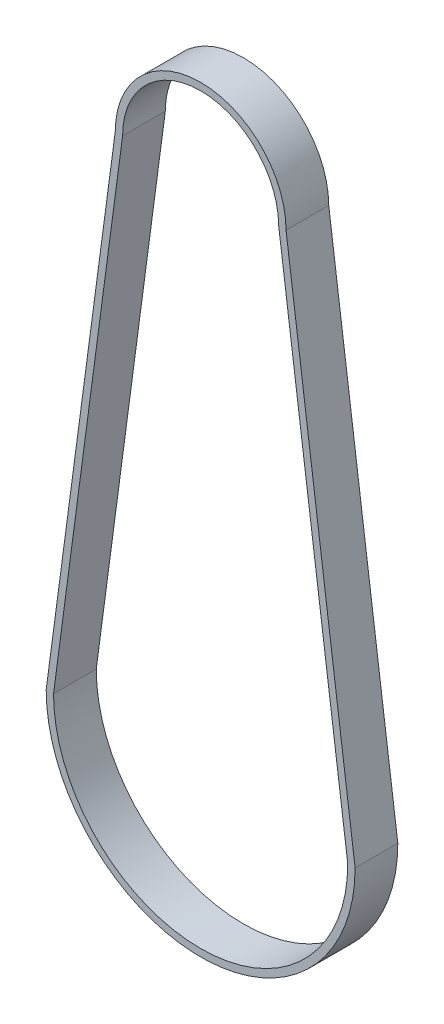
ISO-10303-21;
HEADER;
FILE_DESCRIPTION(('STEP AP214'),'2;1');
FILE_NAME('part.step','',(''),(''),'','','');
FILE_SCHEMA(('AUTOMOTIVE_DESIGN { 1 0 10303 214 1 1 1 1 }'));
ENDSEC;
DATA;
#1=APPLICATION_CONTEXT('core data for automotive mechanical design processes');
#2=APPLICATION_PROTOCOL_DEFINITION('international standard','automotive_design',2000,#1);
#3=PRODUCT_CONTEXT('',#1,'mechanical');
#4=PRODUCT('Part','Part','',(#3));
#5=PRODUCT_RELATED_PRODUCT_CATEGORY('part','',(#4));
#6=PRODUCT_DEFINITION_FORMATION('','',#4);
#7=PRODUCT_DEFINITION_CONTEXT('part definition',#1,'design');
#8=PRODUCT_DEFINITION('design','',#6,#7);
#9=PRODUCT_DEFINITION_SHAPE('','',#8);
#10=(LENGTH_UNIT() NAMED_UNIT(*) SI_UNIT(.MILLI.,.METRE.));
#11=(NAMED_UNIT(*) PLANE_ANGLE_UNIT() SI_UNIT($,.RADIAN.));
#12=(NAMED_UNIT(*) SI_UNIT($,.STERADIAN.) SOLID_ANGLE_UNIT());
#13=UNCERTAINTY_MEASURE_WITH_UNIT(LENGTH_MEASURE(1.E-05),#10,'distance_accuracy_value','');
#14=(GEOMETRIC_REPRESENTATION_CONTEXT(3) GLOBAL_UNCERTAINTY_ASSIGNED_CONTEXT((#13)) GLOBAL_UNIT_ASSIGNED_CONTEXT((#10,
#11,#12)) REPRESENTATION_CONTEXT('',''));
#15=CARTESIAN_POINT('',(0.,0.,0.));
#16=DIRECTION('',(0.,0.,1.));
#17=DIRECTION('',(1.,0.,0.));
#18=AXIS2_PLACEMENT_3D('',#15,#16,#17);
#19=CARTESIAN_POINT('',(0.,0.,-12.5));
#20=DIRECTION('',(0.,0.,1.));
#21=DIRECTION('',(1.,0.,0.));
#22=AXIS2_PLACEMENT_3D('',#19,#20,#21);
#23=CYLINDRICAL_SURFACE('',#22,49.975);
#24=DIRECTION('',(0.,0.,1.));
#25=VECTOR('',#24,1.);
#26=CARTESIAN_POINT('',(-49.975,0.,-12.5));
#27=LINE('',#26,#25);
#28=CARTESIAN_POINT('',(-49.975,0.,-12.5));
#29=VERTEX_POINT('',#28);
#30=CARTESIAN_POINT('',(-49.975,0.,12.5));
#31=VERTEX_POINT('',#30);
#32=EDGE_CURVE('E48',#29,#31,#27,.T.);
#33=ORIENTED_EDGE('',*,*,#32,.T.);
#34=CARTESIAN_POINT('',(0.,0.,12.5));
#35=DIRECTION('',(0.,0.,1.));
#36=DIRECTION('',(1.,0.,0.));
#37=AXIS2_PLACEMENT_3D('',#34,#35,#36);
#38=CIRCLE('',#37,49.975);
#39=CARTESIAN_POINT('',(49.975,0.,12.5));
#40=VERTEX_POINT('',#39);
#41=EDGE_CURVE('E140',#40,#31,#38,.T.);
#42=ORIENTED_EDGE('',*,*,#41,.F.);
#43=DIRECTION('',(0.,0.,1.));
#44=VECTOR('',#43,1.);
#45=CARTESIAN_POINT('',(49.975,0.,-12.5));
#46=LINE('',#45,#44);
#47=CARTESIAN_POINT('',(49.975,0.,-12.5));
#48=VERTEX_POINT('',#47);
#49=EDGE_CURVE('E11',#48,#40,#46,.T.);
#50=ORIENTED_EDGE('',*,*,#49,.F.);
#51=CARTESIAN_POINT('',(0.,0.,-12.5));
#52=DIRECTION('',(0.,0.,1.));
#53=DIRECTION('',(1.,0.,0.));
#54=AXIS2_PLACEMENT_3D('',#51,#52,#53);
#55=CIRCLE('',#54,49.975);
#56=EDGE_CURVE('E159',#48,#29,#55,.T.);
#57=ORIENTED_EDGE('',*,*,#56,.T.);
#58=EDGE_LOOP('',(#33,#42,#50,#57));
#59=FACE_BOUND('',#58,.T.);
#60=ADVANCED_FACE('F45',(#59),#23,.T.);
#61=CARTESIAN_POINT('',(49.975,0.,-12.5));
#62=DIRECTION('',(0.991217183417387,0.132244074718309,0.));
#63=DIRECTION('',(-0.132244074718309,0.991217183417387,0.));
#64=AXIS2_PLACEMENT_3D('',#61,#62,#63);
#65=PLANE('',#64);
#66=ORIENTED_EDGE('',*,*,#49,.T.);
#67=DIRECTION('',(-0.132244074718309,0.991217183417387,0.));
#68=VECTOR('',#67,1.);
#69=CARTESIAN_POINT('',(49.975,0.,12.5));
#70=LINE('',#69,#68);
#71=CARTESIAN_POINT('',(90.3999999999999,-303.,12.5));
#72=VERTEX_POINT('',#71);
#73=EDGE_CURVE('E149',#72,#40,#70,.T.);
#74=ORIENTED_EDGE('',*,*,#73,.F.);
#75=DIRECTION('',(0.,0.,1.));
#76=VECTOR('',#75,1.);
#77=CARTESIAN_POINT('',(90.3999999999999,-303.,-12.5));
#78=LINE('',#77,#76);
#79=CARTESIAN_POINT('',(90.3999999999999,-303.,-12.5));
#80=VERTEX_POINT('',#79);
#81=EDGE_CURVE('E53',#80,#72,#78,.T.);
#82=ORIENTED_EDGE('',*,*,#81,.F.);
#83=DIRECTION('',(-0.132244074718309,0.991217183417387,0.));
#84=VECTOR('',#83,1.);
#85=CARTESIAN_POINT('',(49.975,0.,-12.5));
#86=LINE('',#85,#84);
#87=EDGE_CURVE('E170',#80,#48,#86,.T.);
#88=ORIENTED_EDGE('',*,*,#87,.T.);
#89=EDGE_LOOP('',(#66,#74,#82,#88));
#90=FACE_BOUND('',#89,.T.);
#91=ADVANCED_FACE('F182',(#90),#65,.T.);
#92=CARTESIAN_POINT('',(0.,-303.,-12.5));
#93=DIRECTION('',(0.,0.,1.));
#94=DIRECTION('',(1.,0.,0.));
#95=AXIS2_PLACEMENT_3D('',#92,#93,#94);
#96=CYLINDRICAL_SURFACE('',#95,90.4);
#97=ORIENTED_EDGE('',*,*,#81,.T.);
#98=CARTESIAN_POINT('',(0.,-303.,12.5));
#99=DIRECTION('',(0.,0.,1.));
#100=DIRECTION('',(1.,0.,0.));
#101=AXIS2_PLACEMENT_3D('',#98,#99,#100);
#102=CIRCLE('',#101,90.4);
#103=CARTESIAN_POINT('',(-90.4000000000001,-303.,12.5));
#104=VERTEX_POINT('',#103);
#105=EDGE_CURVE('E146',#104,#72,#102,.T.);
#106=ORIENTED_EDGE('',*,*,#105,.F.);
#107=DIRECTION('',(0.,0.,1.));
#108=VECTOR('',#107,1.);
#109=CARTESIAN_POINT('',(-90.4000000000001,-303.,-12.5));
#110=LINE('',#109,#108);
#111=CARTESIAN_POINT('',(-90.4000000000001,-303.,-12.5));
#112=VERTEX_POINT('',#111);
#113=EDGE_CURVE('E173',#112,#104,#110,.T.);
#114=ORIENTED_EDGE('',*,*,#113,.F.);
#115=CARTESIAN_POINT('',(0.,-303.,-12.5));
#116=DIRECTION('',(0.,0.,1.));
#117=DIRECTION('',(1.,0.,0.));
#118=AXIS2_PLACEMENT_3D('',#115,#116,#117);
#119=CIRCLE('',#118,90.4);
#120=EDGE_CURVE('E167',#112,#80,#119,.T.);
#121=ORIENTED_EDGE('',*,*,#120,.T.);
#122=EDGE_LOOP('',(#97,#106,#114,#121));
#123=FACE_BOUND('',#122,.T.);
#124=ADVANCED_FACE('F188',(#123),#96,.T.);
#125=CARTESIAN_POINT('',(-49.975,0.,-12.5));
#126=DIRECTION('',(-0.991217183417387,0.13224407471831,0.));
#127=DIRECTION('',(-0.13224407471831,-0.991217183417387,0.));
#128=AXIS2_PLACEMENT_3D('',#125,#126,#127);
#129=PLANE('',#128);
#130=ORIENTED_EDGE('',*,*,#113,.T.);
#131=DIRECTION('',(-0.13224407471831,-0.991217183417387,0.));
#132=VECTOR('',#131,1.);
#133=CARTESIAN_POINT('',(-49.975,0.,12.5));
#134=LINE('',#133,#132);
#135=EDGE_CURVE('E143',#31,#104,#134,.T.);
#136=ORIENTED_EDGE('',*,*,#135,.F.);
#137=ORIENTED_EDGE('',*,*,#32,.F.);
#138=DIRECTION('',(-0.13224407471831,-0.991217183417387,0.));
#139=VECTOR('',#138,1.);
#140=CARTESIAN_POINT('',(-49.975,0.,-12.5));
#141=LINE('',#140,#139);
#142=EDGE_CURVE('E164',#29,#112,#141,.T.);
#143=ORIENTED_EDGE('',*,*,#142,.T.);
#144=EDGE_LOOP('',(#130,#136,#137,#143));
#145=FACE_BOUND('',#144,.T.);
#146=ADVANCED_FACE('F177',(#145),#129,.T.);
#147=CARTESIAN_POINT('',(0.,0.,-12.5));
#148=DIRECTION('',(0.,0.,1.));
#149=DIRECTION('',(1.,0.,0.));
#150=AXIS2_PLACEMENT_3D('',#147,#148,#149);
#151=PLANE('',#150);
#152=DIRECTION('',(-0.13224407471831,-0.991217183417387,0.));
#153=VECTOR('',#152,1.);
#154=CARTESIAN_POINT('',(-45.675,0.,-12.5));
#155=LINE('',#154,#153);
#156=CARTESIAN_POINT('',(-45.675,0.,-12.5));
#157=VERTEX_POINT('',#156);
#158=CARTESIAN_POINT('',(-86.1000000000001,-303.,-12.5));
#159=VERTEX_POINT('',#158);
#160=EDGE_CURVE('E122',#157,#159,#155,.T.);
#161=ORIENTED_EDGE('',*,*,#160,.T.);
#162=CARTESIAN_POINT('',(0.,-303.,-12.5));
#163=DIRECTION('',(0.,0.,1.));
#164=DIRECTION('',(1.,0.,0.));
#165=AXIS2_PLACEMENT_3D('',#162,#163,#164);
#166=CIRCLE('',#165,86.1);
#167=CARTESIAN_POINT('',(86.0999999999999,-303.,-12.5));
#168=VERTEX_POINT('',#167);
#169=EDGE_CURVE('E152',#159,#168,#166,.T.);
#170=ORIENTED_EDGE('',*,*,#169,.T.);
#171=DIRECTION('',(-0.132244074718309,0.991217183417387,0.));
#172=VECTOR('',#171,1.);
#173=CARTESIAN_POINT('',(86.0999999999999,-303.,-12.5));
#174=LINE('',#173,#172);
#175=CARTESIAN_POINT('',(45.675,0.,-12.5));
#176=VERTEX_POINT('',#175);
#177=EDGE_CURVE('E117',#168,#176,#174,.T.);
#178=ORIENTED_EDGE('',*,*,#177,.T.);
#179=CARTESIAN_POINT('',(0.,0.,-12.5));
#180=DIRECTION('',(0.,0.,1.));
#181=DIRECTION('',(1.,0.,0.));
#182=AXIS2_PLACEMENT_3D('',#179,#180,#181);
#183=CIRCLE('',#182,45.675);
#184=EDGE_CURVE('E61',#176,#157,#183,.T.);
#185=ORIENTED_EDGE('',*,*,#184,.T.);
#186=EDGE_LOOP('',(#161,#170,#178,#185));
#187=FACE_BOUND('',#186,.T.);
#188=ORIENTED_EDGE('',*,*,#56,.F.);
#189=ORIENTED_EDGE('',*,*,#87,.F.);
#190=ORIENTED_EDGE('',*,*,#120,.F.);
#191=ORIENTED_EDGE('',*,*,#142,.F.);
#192=EDGE_LOOP('',(#188,#189,#190,#191));
#193=FACE_BOUND('',#192,.T.);
#194=ADVANCED_FACE('F186',(#187,#193),#151,.F.);
#195=CARTESIAN_POINT('',(0.,-303.,-12.5));
#196=DIRECTION('',(0.,0.,1.));
#197=DIRECTION('',(1.,0.,0.));
#198=AXIS2_PLACEMENT_3D('',#195,#196,#197);
#199=CYLINDRICAL_SURFACE('',#198,86.1);
#200=DIRECTION('',(0.,0.,1.));
#201=VECTOR('',#200,1.);
#202=CARTESIAN_POINT('',(-86.1000000000001,-303.,-12.5));
#203=LINE('',#202,#201);
#204=CARTESIAN_POINT('',(-86.1000000000001,-303.,12.5));
#205=VERTEX_POINT('',#204);
#206=EDGE_CURVE('E127',#159,#205,#203,.T.);
#207=ORIENTED_EDGE('',*,*,#206,.T.);
#208=CARTESIAN_POINT('',(0.,-303.,12.5));
#209=DIRECTION('',(0.,0.,1.));
#210=DIRECTION('',(1.,0.,0.));
#211=AXIS2_PLACEMENT_3D('',#208,#209,#210);
#212=CIRCLE('',#211,86.1);
#213=CARTESIAN_POINT('',(86.0999999999999,-303.,12.5));
#214=VERTEX_POINT('',#213);
#215=EDGE_CURVE('E125',#205,#214,#212,.T.);
#216=ORIENTED_EDGE('',*,*,#215,.T.);
#217=DIRECTION('',(0.,0.,1.));
#218=VECTOR('',#217,1.);
#219=CARTESIAN_POINT('',(86.0999999999999,-303.,-12.5));
#220=LINE('',#219,#218);
#221=EDGE_CURVE('E110',#168,#214,#220,.T.);
#222=ORIENTED_EDGE('',*,*,#221,.F.);
#223=ORIENTED_EDGE('',*,*,#169,.F.);
#224=EDGE_LOOP('',(#207,#216,#222,#223));
#225=FACE_BOUND('',#224,.T.);
#226=ADVANCED_FACE('F126',(#225),#199,.F.);
#227=CARTESIAN_POINT('',(-45.675,0.,-12.5));
#228=DIRECTION('',(-0.991217183417387,0.13224407471831,0.));
#229=DIRECTION('',(-0.13224407471831,-0.991217183417387,0.));
#230=AXIS2_PLACEMENT_3D('',#227,#228,#229);
#231=PLANE('',#230);
#232=DIRECTION('',(0.,0.,1.));
#233=VECTOR('',#232,1.);
#234=CARTESIAN_POINT('',(-45.675,0.,-12.5));
#235=LINE('',#234,#233);
#236=CARTESIAN_POINT('',(-45.675,0.,12.5));
#237=VERTEX_POINT('',#236);
#238=EDGE_CURVE('E160',#157,#237,#235,.T.);
#239=ORIENTED_EDGE('',*,*,#238,.T.);
#240=DIRECTION('',(-0.13224407471831,-0.991217183417387,0.));
#241=VECTOR('',#240,1.);
#242=CARTESIAN_POINT('',(-45.675,0.,12.5));
#243=LINE('',#242,#241);
#244=EDGE_CURVE('E136',#237,#205,#243,.T.);
#245=ORIENTED_EDGE('',*,*,#244,.T.);
#246=ORIENTED_EDGE('',*,*,#206,.F.);
#247=ORIENTED_EDGE('',*,*,#160,.F.);
#248=EDGE_LOOP('',(#239,#245,#246,#247));
#249=FACE_BOUND('',#248,.T.);
#250=ADVANCED_FACE('F223',(#249),#231,.F.);
#251=CARTESIAN_POINT('',(0.,0.,-12.5));
#252=DIRECTION('',(0.,0.,1.));
#253=DIRECTION('',(1.,0.,0.));
#254=AXIS2_PLACEMENT_3D('',#251,#252,#253);
#255=CYLINDRICAL_SURFACE('',#254,45.675);
#256=DIRECTION('',(0.,0.,1.));
#257=VECTOR('',#256,1.);
#258=CARTESIAN_POINT('',(45.675,0.,-12.5));
#259=LINE('',#258,#257);
#260=CARTESIAN_POINT('',(45.675,0.,12.5));
#261=VERTEX_POINT('',#260);
#262=EDGE_CURVE('E121',#176,#261,#259,.T.);
#263=ORIENTED_EDGE('',*,*,#262,.T.);
#264=CARTESIAN_POINT('',(0.,0.,12.5));
#265=DIRECTION('',(0.,0.,1.));
#266=DIRECTION('',(1.,0.,0.));
#267=AXIS2_PLACEMENT_3D('',#264,#265,#266);
#268=CIRCLE('',#267,45.675);
#269=EDGE_CURVE('E134',#261,#237,#268,.T.);
#270=ORIENTED_EDGE('',*,*,#269,.T.);
#271=ORIENTED_EDGE('',*,*,#238,.F.);
#272=ORIENTED_EDGE('',*,*,#184,.F.);
#273=EDGE_LOOP('',(#263,#270,#271,#272));
#274=FACE_BOUND('',#273,.T.);
#275=ADVANCED_FACE('F230',(#274),#255,.F.);
#276=CARTESIAN_POINT('',(86.0999999999999,-303.,-12.5));
#277=DIRECTION('',(0.991217183417387,0.132244074718309,0.));
#278=DIRECTION('',(-0.132244074718309,0.991217183417387,0.));
#279=AXIS2_PLACEMENT_3D('',#276,#277,#278);
#280=PLANE('',#279);
#281=ORIENTED_EDGE('',*,*,#221,.T.);
#282=DIRECTION('',(-0.132244074718309,0.991217183417387,0.));
#283=VECTOR('',#282,1.);
#284=CARTESIAN_POINT('',(86.0999999999999,-303.,12.5));
#285=LINE('',#284,#283);
#286=EDGE_CURVE('E114',#214,#261,#285,.T.);
#287=ORIENTED_EDGE('',*,*,#286,.T.);
#288=ORIENTED_EDGE('',*,*,#262,.F.);
#289=ORIENTED_EDGE('',*,*,#177,.F.);
#290=EDGE_LOOP('',(#281,#287,#288,#289));
#291=FACE_BOUND('',#290,.T.);
#292=ADVANCED_FACE('F112',(#291),#280,.F.);
#293=CARTESIAN_POINT('',(0.,0.,12.5));
#294=DIRECTION('',(0.,0.,1.));
#295=DIRECTION('',(1.,0.,0.));
#296=AXIS2_PLACEMENT_3D('',#293,#294,#295);
#297=PLANE('',#296);
#298=ORIENTED_EDGE('',*,*,#41,.T.);
#299=ORIENTED_EDGE('',*,*,#135,.T.);
#300=ORIENTED_EDGE('',*,*,#105,.T.);
#301=ORIENTED_EDGE('',*,*,#73,.T.);
#302=EDGE_LOOP('',(#298,#299,#300,#301));
#303=FACE_BOUND('',#302,.T.);
#304=ORIENTED_EDGE('',*,*,#286,.F.);
#305=ORIENTED_EDGE('',*,*,#215,.F.);
#306=ORIENTED_EDGE('',*,*,#244,.F.);
#307=ORIENTED_EDGE('',*,*,#269,.F.);
#308=EDGE_LOOP('',(#304,#305,#306,#307));
#309=FACE_BOUND('',#308,.T.);
#310=ADVANCED_FACE('F132',(#303,#309),#297,.T.);
#311=CLOSED_SHELL('',(#60,#91,#124,#146,#194,#226,#250,#275,#292,#310));
#312=MANIFOLD_SOLID_BREP('B2',#311);
#313=ADVANCED_BREP_SHAPE_REPRESENTATION('',(#18,#312),#14);
#314=SHAPE_DEFINITION_REPRESENTATION(#9,#313);
ENDSEC;
END-ISO-10303-21;
